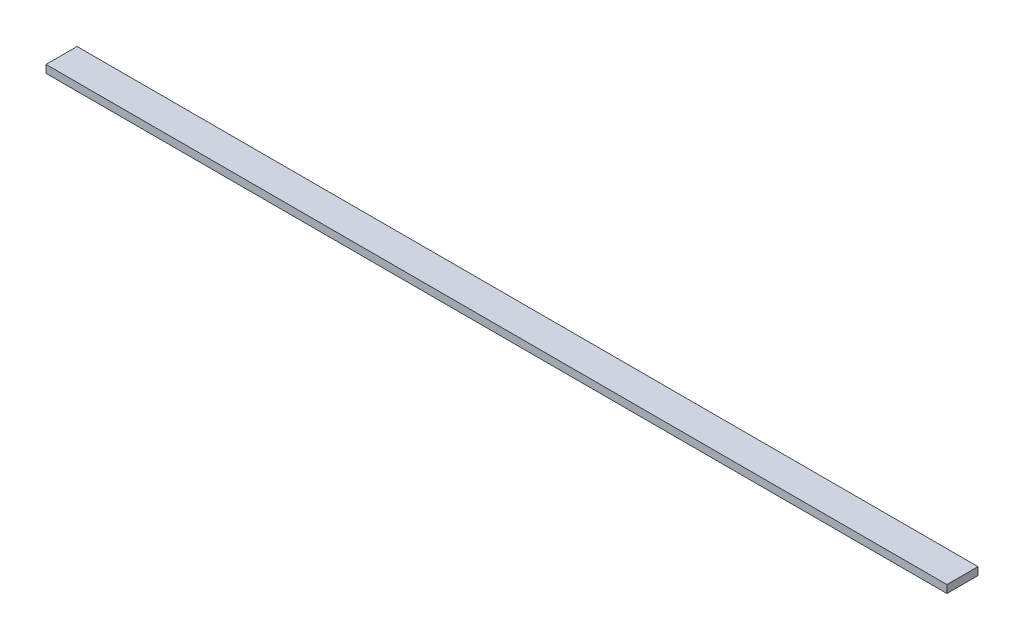
ISO-10303-21;
HEADER;
FILE_DESCRIPTION(('STEP AP214'),'2;1');
FILE_NAME('part.step','',(''),(''),'','','');
FILE_SCHEMA(('AUTOMOTIVE_DESIGN { 1 0 10303 214 1 1 1 1 }'));
ENDSEC;
DATA;
#1=APPLICATION_CONTEXT('core data for automotive mechanical design processes');
#2=APPLICATION_PROTOCOL_DEFINITION('international standard','automotive_design',2000,#1);
#3=PRODUCT_CONTEXT('',#1,'mechanical');
#4=PRODUCT('Part','Part','',(#3));
#5=PRODUCT_RELATED_PRODUCT_CATEGORY('part','',(#4));
#6=PRODUCT_DEFINITION_FORMATION('','',#4);
#7=PRODUCT_DEFINITION_CONTEXT('part definition',#1,'design');
#8=PRODUCT_DEFINITION('design','',#6,#7);
#9=PRODUCT_DEFINITION_SHAPE('','',#8);
#10=(LENGTH_UNIT() NAMED_UNIT(*) SI_UNIT(.MILLI.,.METRE.));
#11=(NAMED_UNIT(*) PLANE_ANGLE_UNIT() SI_UNIT($,.RADIAN.));
#12=(NAMED_UNIT(*) SI_UNIT($,.STERADIAN.) SOLID_ANGLE_UNIT());
#13=UNCERTAINTY_MEASURE_WITH_UNIT(LENGTH_MEASURE(1.E-05),#10,'distance_accuracy_value','');
#14=(GEOMETRIC_REPRESENTATION_CONTEXT(3) GLOBAL_UNCERTAINTY_ASSIGNED_CONTEXT((#13)) GLOBAL_UNIT_ASSIGNED_CONTEXT((#10,
#11,#12)) REPRESENTATION_CONTEXT('',''));
#15=CARTESIAN_POINT('',(0.,0.,0.));
#16=DIRECTION('',(0.,0.,1.));
#17=DIRECTION('',(1.,0.,0.));
#18=AXIS2_PLACEMENT_3D('',#15,#16,#17);
#19=CARTESIAN_POINT('',(92.0749999999997,1.5875,-3.175));
#20=DIRECTION('',(-1.,0.,0.));
#21=DIRECTION('',(0.,0.,1.));
#22=AXIS2_PLACEMENT_3D('',#19,#20,#21);
#23=PLANE('',#22);
#24=DIRECTION('',(0.,0.,-1.));
#25=VECTOR('',#24,1.);
#26=CARTESIAN_POINT('',(92.0749999999997,0.,-3.175));
#27=LINE('',#26,#25);
#28=CARTESIAN_POINT('',(92.0749999999997,0.,3.17499999999999));
#29=VERTEX_POINT('',#28);
#30=CARTESIAN_POINT('',(92.0749999999997,0.,-3.175));
#31=VERTEX_POINT('',#30);
#32=EDGE_CURVE('E97',#29,#31,#27,.T.);
#33=ORIENTED_EDGE('',*,*,#32,.T.);
#34=DIRECTION('',(0.,-1.,0.));
#35=VECTOR('',#34,1.);
#36=CARTESIAN_POINT('',(92.0749999999997,1.5875,-3.175));
#37=LINE('',#36,#35);
#38=CARTESIAN_POINT('',(92.0749999999997,1.5875,-3.175));
#39=VERTEX_POINT('',#38);
#40=EDGE_CURVE('E11',#39,#31,#37,.T.);
#41=ORIENTED_EDGE('',*,*,#40,.F.);
#42=DIRECTION('',(0.,0.,-1.));
#43=VECTOR('',#42,1.);
#44=CARTESIAN_POINT('',(92.0749999999997,1.5875,-3.175));
#45=LINE('',#44,#43);
#46=CARTESIAN_POINT('',(92.0749999999997,1.5875,3.17499999999999));
#47=VERTEX_POINT('',#46);
#48=EDGE_CURVE('E85',#47,#39,#45,.T.);
#49=ORIENTED_EDGE('',*,*,#48,.F.);
#50=DIRECTION('',(0.,-1.,0.));
#51=VECTOR('',#50,1.);
#52=CARTESIAN_POINT('',(92.0749999999997,1.5875,3.17499999999999));
#53=LINE('',#52,#51);
#54=EDGE_CURVE('E93',#47,#29,#53,.T.);
#55=ORIENTED_EDGE('',*,*,#54,.T.);
#56=EDGE_LOOP('',(#33,#41,#49,#55));
#57=FACE_BOUND('',#56,.T.);
#58=ADVANCED_FACE('F34',(#57),#23,.F.);
#59=CARTESIAN_POINT('',(-92.0750000000003,1.5875,-3.175));
#60=DIRECTION('',(0.,0.,1.));
#61=DIRECTION('',(1.,0.,0.));
#62=AXIS2_PLACEMENT_3D('',#59,#60,#61);
#63=PLANE('',#62);
#64=DIRECTION('',(-1.,0.,0.));
#65=VECTOR('',#64,1.);
#66=CARTESIAN_POINT('',(-92.0750000000003,0.,-3.175));
#67=LINE('',#66,#65);
#68=CARTESIAN_POINT('',(-92.0750000000003,0.,-3.175));
#69=VERTEX_POINT('',#68);
#70=EDGE_CURVE('E89',#31,#69,#67,.T.);
#71=ORIENTED_EDGE('',*,*,#70,.T.);
#72=DIRECTION('',(0.,-1.,0.));
#73=VECTOR('',#72,1.);
#74=CARTESIAN_POINT('',(-92.0750000000003,1.5875,-3.175));
#75=LINE('',#74,#73);
#76=CARTESIAN_POINT('',(-92.0750000000003,1.5875,-3.175));
#77=VERTEX_POINT('',#76);
#78=EDGE_CURVE('E42',#77,#69,#75,.T.);
#79=ORIENTED_EDGE('',*,*,#78,.F.);
#80=DIRECTION('',(-1.,0.,0.));
#81=VECTOR('',#80,1.);
#82=CARTESIAN_POINT('',(-92.0750000000003,1.5875,-3.175));
#83=LINE('',#82,#81);
#84=EDGE_CURVE('E80',#39,#77,#83,.T.);
#85=ORIENTED_EDGE('',*,*,#84,.F.);
#86=ORIENTED_EDGE('',*,*,#40,.T.);
#87=EDGE_LOOP('',(#71,#79,#85,#86));
#88=FACE_BOUND('',#87,.T.);
#89=ADVANCED_FACE('F88',(#88),#63,.F.);
#90=CARTESIAN_POINT('',(-92.0750000000003,1.5875,-3.175));
#91=DIRECTION('',(1.,0.,0.));
#92=DIRECTION('',(0.,0.,-1.));
#93=AXIS2_PLACEMENT_3D('',#90,#91,#92);
#94=PLANE('',#93);
#95=DIRECTION('',(0.,0.,1.));
#96=VECTOR('',#95,1.);
#97=CARTESIAN_POINT('',(-92.0750000000003,0.,-3.175));
#98=LINE('',#97,#96);
#99=CARTESIAN_POINT('',(-92.0750000000003,0.,3.17499999999999));
#100=VERTEX_POINT('',#99);
#101=EDGE_CURVE('E67',#69,#100,#98,.T.);
#102=ORIENTED_EDGE('',*,*,#101,.T.);
#103=DIRECTION('',(0.,-1.,0.));
#104=VECTOR('',#103,1.);
#105=CARTESIAN_POINT('',(-92.0750000000003,1.5875,3.17499999999999));
#106=LINE('',#105,#104);
#107=CARTESIAN_POINT('',(-92.0750000000003,1.5875,3.17499999999999));
#108=VERTEX_POINT('',#107);
#109=EDGE_CURVE('E90',#108,#100,#106,.T.);
#110=ORIENTED_EDGE('',*,*,#109,.F.);
#111=DIRECTION('',(0.,0.,1.));
#112=VECTOR('',#111,1.);
#113=CARTESIAN_POINT('',(-92.0750000000003,1.5875,-3.175));
#114=LINE('',#113,#112);
#115=EDGE_CURVE('E83',#77,#108,#114,.T.);
#116=ORIENTED_EDGE('',*,*,#115,.F.);
#117=ORIENTED_EDGE('',*,*,#78,.T.);
#118=EDGE_LOOP('',(#102,#110,#116,#117));
#119=FACE_BOUND('',#118,.T.);
#120=ADVANCED_FACE('F91',(#119),#94,.F.);
#121=CARTESIAN_POINT('',(-92.0750000000003,1.5875,3.17499999999999));
#122=DIRECTION('',(0.,0.,-1.));
#123=DIRECTION('',(-1.,0.,0.));
#124=AXIS2_PLACEMENT_3D('',#121,#122,#123);
#125=PLANE('',#124);
#126=DIRECTION('',(1.,0.,0.));
#127=VECTOR('',#126,1.);
#128=CARTESIAN_POINT('',(-92.0750000000003,0.,3.17499999999999));
#129=LINE('',#128,#127);
#130=EDGE_CURVE('E73',#100,#29,#129,.T.);
#131=ORIENTED_EDGE('',*,*,#130,.T.);
#132=ORIENTED_EDGE('',*,*,#54,.F.);
#133=DIRECTION('',(1.,0.,0.));
#134=VECTOR('',#133,1.);
#135=CARTESIAN_POINT('',(-92.0750000000003,1.5875,3.17499999999999));
#136=LINE('',#135,#134);
#137=EDGE_CURVE('E50',#108,#47,#136,.T.);
#138=ORIENTED_EDGE('',*,*,#137,.F.);
#139=ORIENTED_EDGE('',*,*,#109,.T.);
#140=EDGE_LOOP('',(#131,#132,#138,#139));
#141=FACE_BOUND('',#140,.T.);
#142=ADVANCED_FACE('F104',(#141),#125,.F.);
#143=CARTESIAN_POINT('',(0.,1.5875,0.));
#144=DIRECTION('',(0.,1.,0.));
#145=DIRECTION('',(0.,0.,1.));
#146=AXIS2_PLACEMENT_3D('',#143,#144,#145);
#147=PLANE('',#146);
#148=ORIENTED_EDGE('',*,*,#48,.T.);
#149=ORIENTED_EDGE('',*,*,#84,.T.);
#150=ORIENTED_EDGE('',*,*,#115,.T.);
#151=ORIENTED_EDGE('',*,*,#137,.T.);
#152=EDGE_LOOP('',(#148,#149,#150,#151));
#153=FACE_BOUND('',#152,.T.);
#154=ADVANCED_FACE('F81',(#153),#147,.T.);
#155=CARTESIAN_POINT('',(0.,0.,0.));
#156=DIRECTION('',(0.,1.,0.));
#157=DIRECTION('',(0.,0.,1.));
#158=AXIS2_PLACEMENT_3D('',#155,#156,#157);
#159=PLANE('',#158);
#160=ORIENTED_EDGE('',*,*,#32,.F.);
#161=ORIENTED_EDGE('',*,*,#130,.F.);
#162=ORIENTED_EDGE('',*,*,#101,.F.);
#163=ORIENTED_EDGE('',*,*,#70,.F.);
#164=EDGE_LOOP('',(#160,#161,#162,#163));
#165=FACE_BOUND('',#164,.T.);
#166=ADVANCED_FACE('F107',(#165),#159,.F.);
#167=CLOSED_SHELL('',(#58,#89,#120,#142,#154,#166));
#168=MANIFOLD_SOLID_BREP('B2',#167);
#169=ADVANCED_BREP_SHAPE_REPRESENTATION('',(#18,#168),#14);
#170=SHAPE_DEFINITION_REPRESENTATION(#9,#169);
ENDSEC;
END-ISO-10303-21;
